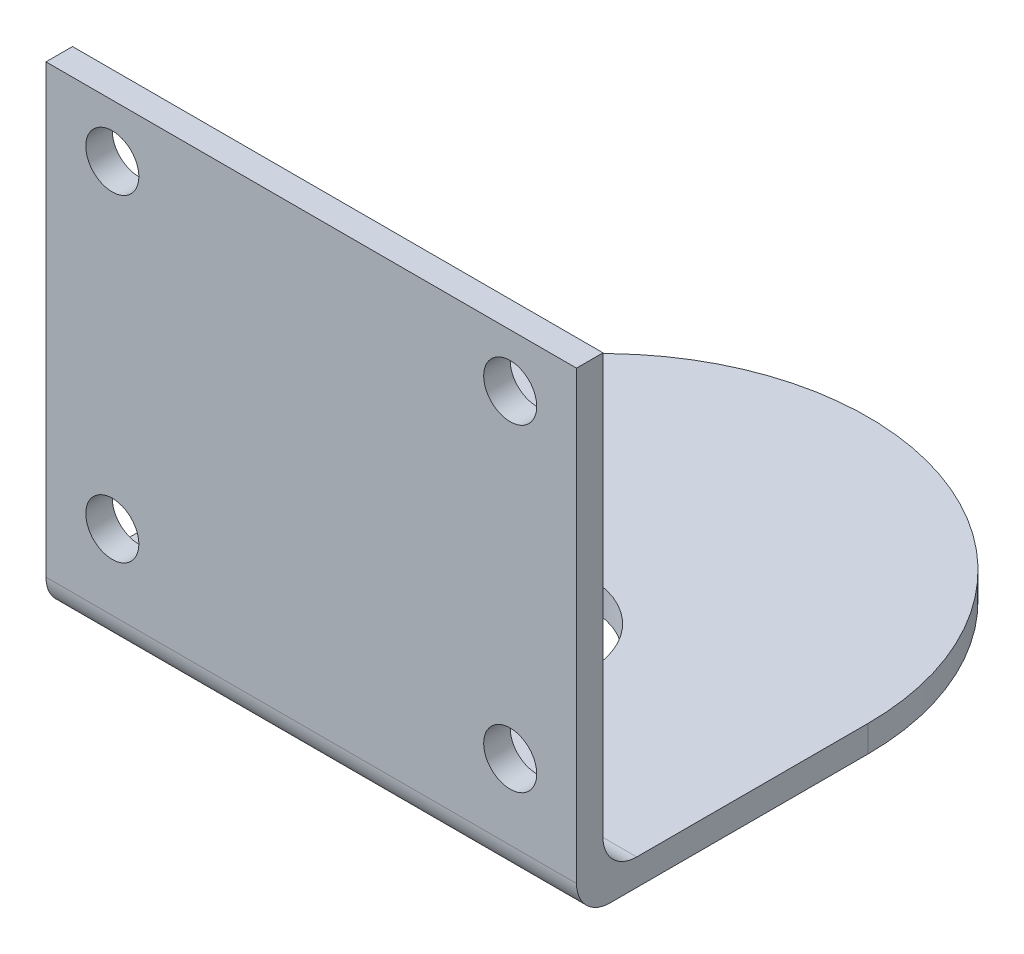
ISO-10303-21;
HEADER;
FILE_DESCRIPTION(('STEP AP214'),'2;1');
FILE_NAME('part.step','',(''),(''),'','','');
FILE_SCHEMA(('AUTOMOTIVE_DESIGN { 1 0 10303 214 1 1 1 1 }'));
ENDSEC;
DATA;
#1=APPLICATION_CONTEXT('core data for automotive mechanical design processes');
#2=APPLICATION_PROTOCOL_DEFINITION('international standard','automotive_design',2000,#1);
#3=PRODUCT_CONTEXT('',#1,'mechanical');
#4=PRODUCT('Part','Part','',(#3));
#5=PRODUCT_RELATED_PRODUCT_CATEGORY('part','',(#4));
#6=PRODUCT_DEFINITION_FORMATION('','',#4);
#7=PRODUCT_DEFINITION_CONTEXT('part definition',#1,'design');
#8=PRODUCT_DEFINITION('design','',#6,#7);
#9=PRODUCT_DEFINITION_SHAPE('','',#8);
#10=(LENGTH_UNIT() NAMED_UNIT(*) SI_UNIT(.MILLI.,.METRE.));
#11=(NAMED_UNIT(*) PLANE_ANGLE_UNIT() SI_UNIT($,.RADIAN.));
#12=(NAMED_UNIT(*) SI_UNIT($,.STERADIAN.) SOLID_ANGLE_UNIT());
#13=UNCERTAINTY_MEASURE_WITH_UNIT(LENGTH_MEASURE(1.E-05),#10,'distance_accuracy_value','');
#14=(GEOMETRIC_REPRESENTATION_CONTEXT(3) GLOBAL_UNCERTAINTY_ASSIGNED_CONTEXT((#13)) GLOBAL_UNIT_ASSIGNED_CONTEXT((#10,
#11,#12)) REPRESENTATION_CONTEXT('',''));
#15=CARTESIAN_POINT('',(0.,0.,0.));
#16=DIRECTION('',(0.,0.,1.));
#17=DIRECTION('',(1.,0.,0.));
#18=AXIS2_PLACEMENT_3D('',#15,#16,#17);
#19=CARTESIAN_POINT('',(-20.0025,-18.0975,2.));
#20=DIRECTION('',(0.,1.,0.));
#21=DIRECTION('',(0.,0.,1.));
#22=AXIS2_PLACEMENT_3D('',#19,#20,#21);
#23=PLANE('',#22);
#24=CARTESIAN_POINT('',(0.,-18.0975,-13.));
#25=DIRECTION('',(0.,1.,0.));
#26=DIRECTION('',(0.,0.,1.));
#27=AXIS2_PLACEMENT_3D('',#24,#25,#26);
#28=CIRCLE('',#27,6.);
#29=CARTESIAN_POINT('',(0.,-18.0975,-7.));
#30=VERTEX_POINT('',#29);
#31=EDGE_CURVE('E265',#30,#30,#28,.T.);
#32=ORIENTED_EDGE('',*,*,#31,.T.);
#33=EDGE_LOOP('',(#32));
#34=FACE_BOUND('',#33,.T.);
#35=DIRECTION('',(0.,0.,-1.));
#36=VECTOR('',#35,1.);
#37=CARTESIAN_POINT('',(20.0025,-18.0975,2.));
#38=LINE('',#37,#36);
#39=CARTESIAN_POINT('',(20.0025,-18.0975,-0.54));
#40=VERTEX_POINT('',#39);
#41=CARTESIAN_POINT('',(20.0025,-18.0975,-19.9975));
#42=VERTEX_POINT('',#41);
#43=EDGE_CURVE('E175',#40,#42,#38,.T.);
#44=ORIENTED_EDGE('',*,*,#43,.F.);
#45=DIRECTION('',(1.,0.,0.));
#46=VECTOR('',#45,1.);
#47=CARTESIAN_POINT('',(-20.0025,-18.0975,-0.54));
#48=LINE('',#47,#46);
#49=CARTESIAN_POINT('',(-20.0025,-18.0975,-0.54));
#50=VERTEX_POINT('',#49);
#51=EDGE_CURVE('E59',#40,#50,#48,.F.);
#52=ORIENTED_EDGE('',*,*,#51,.T.);
#53=DIRECTION('',(0.,0.,-1.));
#54=VECTOR('',#53,1.);
#55=CARTESIAN_POINT('',(-20.0025,-18.0975,2.));
#56=LINE('',#55,#54);
#57=CARTESIAN_POINT('',(-20.0025,-18.0975,-19.9975));
#58=VERTEX_POINT('',#57);
#59=EDGE_CURVE('E156',#50,#58,#56,.T.);
#60=ORIENTED_EDGE('',*,*,#59,.T.);
#61=CARTESIAN_POINT('',(0.,-18.0975,-19.9975));
#62=DIRECTION('',(0.,-1.,0.));
#63=DIRECTION('',(0.,0.,-1.));
#64=AXIS2_PLACEMENT_3D('',#61,#62,#63);
#65=CIRCLE('',#64,20.0025);
#66=EDGE_CURVE('E119',#58,#42,#65,.T.);
#67=ORIENTED_EDGE('',*,*,#66,.T.);
#68=EDGE_LOOP('',(#44,#52,#60,#67));
#69=FACE_BOUND('',#68,.T.);
#70=ADVANCED_FACE('F42',(#34,#69),#23,.F.);
#71=CARTESIAN_POINT('',(20.0025,-18.0975,2.));
#72=DIRECTION('',(-1.,0.,0.));
#73=DIRECTION('',(0.,0.,1.));
#74=AXIS2_PLACEMENT_3D('',#71,#72,#73);
#75=PLANE('',#74);
#76=DIRECTION('',(0.,1.,0.));
#77=VECTOR('',#76,1.);
#78=CARTESIAN_POINT('',(20.0025,-18.0975,2.));
#79=LINE('',#78,#77);
#80=CARTESIAN_POINT('',(20.0025,-15.5575,2.));
#81=VERTEX_POINT('',#80);
#82=CARTESIAN_POINT('',(20.0025,18.0975,2.));
#83=VERTEX_POINT('',#82);
#84=EDGE_CURVE('E145',#81,#83,#79,.T.);
#85=ORIENTED_EDGE('',*,*,#84,.F.);
#86=CARTESIAN_POINT('',(20.0025,-15.5575,-0.54));
#87=DIRECTION('',(-1.,0.,0.));
#88=DIRECTION('',(0.,0.,1.));
#89=AXIS2_PLACEMENT_3D('',#86,#87,#88);
#90=CIRCLE('',#89,2.54);
#91=EDGE_CURVE('E67',#81,#40,#90,.F.);
#92=ORIENTED_EDGE('',*,*,#91,.T.);
#93=ORIENTED_EDGE('',*,*,#43,.T.);
#94=DIRECTION('',(0.,-1.,0.));
#95=VECTOR('',#94,1.);
#96=CARTESIAN_POINT('',(20.0025,-16.0975,-19.9975));
#97=LINE('',#96,#95);
#98=CARTESIAN_POINT('',(20.0025,-16.0975,-19.9975));
#99=VERTEX_POINT('',#98);
#100=EDGE_CURVE('E127',#99,#42,#97,.T.);
#101=ORIENTED_EDGE('',*,*,#100,.F.);
#102=DIRECTION('',(0.,0.,-1.));
#103=VECTOR('',#102,1.);
#104=CARTESIAN_POINT('',(20.0025,-16.0975,0.));
#105=LINE('',#104,#103);
#106=CARTESIAN_POINT('',(20.0025,-16.0975,-2.54));
#107=VERTEX_POINT('',#106);
#108=EDGE_CURVE('E128',#107,#99,#105,.T.);
#109=ORIENTED_EDGE('',*,*,#108,.F.);
#110=CARTESIAN_POINT('',(20.0025,-13.5575,-2.54));
#111=DIRECTION('',(-1.,0.,0.));
#112=DIRECTION('',(0.,0.,1.));
#113=AXIS2_PLACEMENT_3D('',#110,#111,#112);
#114=CIRCLE('',#113,2.54);
#115=CARTESIAN_POINT('',(20.0025,-13.5575,0.));
#116=VERTEX_POINT('',#115);
#117=EDGE_CURVE('E11',#107,#116,#114,.T.);
#118=ORIENTED_EDGE('',*,*,#117,.T.);
#119=DIRECTION('',(0.,1.,0.));
#120=VECTOR('',#119,1.);
#121=CARTESIAN_POINT('',(20.0025,-18.0975,0.));
#122=LINE('',#121,#120);
#123=CARTESIAN_POINT('',(20.0025,18.0975,0.));
#124=VERTEX_POINT('',#123);
#125=EDGE_CURVE('E143',#116,#124,#122,.T.);
#126=ORIENTED_EDGE('',*,*,#125,.T.);
#127=DIRECTION('',(0.,0.,-1.));
#128=VECTOR('',#127,1.);
#129=CARTESIAN_POINT('',(20.0025,18.0975,2.));
#130=LINE('',#129,#128);
#131=EDGE_CURVE('E171',#83,#124,#130,.T.);
#132=ORIENTED_EDGE('',*,*,#131,.F.);
#133=EDGE_LOOP('',(#85,#92,#93,#101,#109,#118,#126,#132));
#134=FACE_BOUND('',#133,.T.);
#135=ADVANCED_FACE('F217',(#134),#75,.F.);
#136=CARTESIAN_POINT('',(-20.0025,18.0975,2.));
#137=DIRECTION('',(0.,1.,0.));
#138=DIRECTION('',(0.,0.,1.));
#139=AXIS2_PLACEMENT_3D('',#136,#137,#138);
#140=PLANE('',#139);
#141=DIRECTION('',(1.,0.,0.));
#142=VECTOR('',#141,1.);
#143=CARTESIAN_POINT('',(-20.0025,18.0975,0.));
#144=LINE('',#143,#142);
#145=CARTESIAN_POINT('',(-20.0025,18.0975,0.));
#146=VERTEX_POINT('',#145);
#147=EDGE_CURVE('E159',#146,#124,#144,.T.);
#148=ORIENTED_EDGE('',*,*,#147,.F.);
#149=DIRECTION('',(0.,0.,-1.));
#150=VECTOR('',#149,1.);
#151=CARTESIAN_POINT('',(-20.0025,18.0975,2.));
#152=LINE('',#151,#150);
#153=CARTESIAN_POINT('',(-20.0025,18.0975,2.));
#154=VERTEX_POINT('',#153);
#155=EDGE_CURVE('E167',#154,#146,#152,.T.);
#156=ORIENTED_EDGE('',*,*,#155,.F.);
#157=DIRECTION('',(1.,0.,0.));
#158=VECTOR('',#157,1.);
#159=CARTESIAN_POINT('',(-20.0025,18.0975,2.));
#160=LINE('',#159,#158);
#161=EDGE_CURVE('E148',#154,#83,#160,.T.);
#162=ORIENTED_EDGE('',*,*,#161,.T.);
#163=ORIENTED_EDGE('',*,*,#131,.T.);
#164=EDGE_LOOP('',(#148,#156,#162,#163));
#165=FACE_BOUND('',#164,.T.);
#166=ADVANCED_FACE('F225',(#165),#140,.T.);
#167=CARTESIAN_POINT('',(-20.0025,-18.0975,2.));
#168=DIRECTION('',(-1.,0.,0.));
#169=DIRECTION('',(0.,0.,1.));
#170=AXIS2_PLACEMENT_3D('',#167,#168,#169);
#171=PLANE('',#170);
#172=ORIENTED_EDGE('',*,*,#59,.F.);
#173=CARTESIAN_POINT('',(-20.0025,-15.5575,-0.54));
#174=DIRECTION('',(-1.,0.,0.));
#175=DIRECTION('',(0.,0.,1.));
#176=AXIS2_PLACEMENT_3D('',#173,#174,#175);
#177=CIRCLE('',#176,2.54);
#178=CARTESIAN_POINT('',(-20.0025,-15.5575,2.));
#179=VERTEX_POINT('',#178);
#180=EDGE_CURVE('E193',#50,#179,#177,.T.);
#181=ORIENTED_EDGE('',*,*,#180,.T.);
#182=DIRECTION('',(0.,1.,0.));
#183=VECTOR('',#182,1.);
#184=CARTESIAN_POINT('',(-20.0025,-18.0975,2.));
#185=LINE('',#184,#183);
#186=EDGE_CURVE('E153',#179,#154,#185,.T.);
#187=ORIENTED_EDGE('',*,*,#186,.T.);
#188=ORIENTED_EDGE('',*,*,#155,.T.);
#189=DIRECTION('',(0.,1.,0.));
#190=VECTOR('',#189,1.);
#191=CARTESIAN_POINT('',(-20.0025,-18.0975,0.));
#192=LINE('',#191,#190);
#193=CARTESIAN_POINT('',(-20.0025,-13.5575,0.));
#194=VERTEX_POINT('',#193);
#195=EDGE_CURVE('E149',#194,#146,#192,.T.);
#196=ORIENTED_EDGE('',*,*,#195,.F.);
#197=CARTESIAN_POINT('',(-20.0025,-13.5575,-2.54));
#198=DIRECTION('',(-1.,0.,0.));
#199=DIRECTION('',(0.,0.,1.));
#200=AXIS2_PLACEMENT_3D('',#197,#198,#199);
#201=CIRCLE('',#200,2.54);
#202=CARTESIAN_POINT('',(-20.0025,-16.0975,-2.54));
#203=VERTEX_POINT('',#202);
#204=EDGE_CURVE('E52',#194,#203,#201,.F.);
#205=ORIENTED_EDGE('',*,*,#204,.T.);
#206=DIRECTION('',(0.,0.,-1.));
#207=VECTOR('',#206,1.);
#208=CARTESIAN_POINT('',(-20.0025,-16.0975,0.));
#209=LINE('',#208,#207);
#210=CARTESIAN_POINT('',(-20.0025,-16.0975,-19.9975));
#211=VERTEX_POINT('',#210);
#212=EDGE_CURVE('E108',#203,#211,#209,.T.);
#213=ORIENTED_EDGE('',*,*,#212,.T.);
#214=DIRECTION('',(0.,-1.,0.));
#215=VECTOR('',#214,1.);
#216=CARTESIAN_POINT('',(-20.0025,-16.0975,-19.9975));
#217=LINE('',#216,#215);
#218=EDGE_CURVE('E111',#211,#58,#217,.T.);
#219=ORIENTED_EDGE('',*,*,#218,.T.);
#220=EDGE_LOOP('',(#172,#181,#187,#188,#196,#205,#213,#219));
#221=FACE_BOUND('',#220,.T.);
#222=ADVANCED_FACE('F110',(#221),#171,.T.);
#223=CARTESIAN_POINT('',(0.,0.,2.));
#224=DIRECTION('',(0.,0.,1.));
#225=DIRECTION('',(1.,0.,0.));
#226=AXIS2_PLACEMENT_3D('',#223,#224,#225);
#227=PLANE('',#226);
#228=CARTESIAN_POINT('',(15.0025,-9.9025,2.));
#229=DIRECTION('',(0.,0.,-1.));
#230=DIRECTION('',(-1.,0.,0.));
#231=AXIS2_PLACEMENT_3D('',#228,#229,#230);
#232=CIRCLE('',#231,2.);
#233=CARTESIAN_POINT('',(13.0025,-9.9025,2.));
#234=VERTEX_POINT('',#233);
#235=EDGE_CURVE('E267',#234,#234,#232,.T.);
#236=ORIENTED_EDGE('',*,*,#235,.T.);
#237=EDGE_LOOP('',(#236));
#238=FACE_BOUND('',#237,.T.);
#239=CARTESIAN_POINT('',(-15.0025,-9.9025,2.));
#240=DIRECTION('',(0.,0.,-1.));
#241=DIRECTION('',(-1.,0.,0.));
#242=AXIS2_PLACEMENT_3D('',#239,#240,#241);
#243=CIRCLE('',#242,2.00000000000001);
#244=CARTESIAN_POINT('',(-17.0025,-9.9025,2.));
#245=VERTEX_POINT('',#244);
#246=EDGE_CURVE('E288',#245,#245,#243,.T.);
#247=ORIENTED_EDGE('',*,*,#246,.T.);
#248=EDGE_LOOP('',(#247));
#249=FACE_BOUND('',#248,.T.);
#250=CARTESIAN_POINT('',(-15.0025,14.0975,2.));
#251=DIRECTION('',(0.,0.,-1.));
#252=DIRECTION('',(-1.,0.,0.));
#253=AXIS2_PLACEMENT_3D('',#250,#251,#252);
#254=CIRCLE('',#253,2.);
#255=CARTESIAN_POINT('',(-17.0025,14.0975,2.));
#256=VERTEX_POINT('',#255);
#257=EDGE_CURVE('E280',#256,#256,#254,.T.);
#258=ORIENTED_EDGE('',*,*,#257,.T.);
#259=EDGE_LOOP('',(#258));
#260=FACE_BOUND('',#259,.T.);
#261=CARTESIAN_POINT('',(15.0025,14.0975,2.));
#262=DIRECTION('',(0.,0.,-1.));
#263=DIRECTION('',(-1.,0.,0.));
#264=AXIS2_PLACEMENT_3D('',#261,#262,#263);
#265=CIRCLE('',#264,2.);
#266=CARTESIAN_POINT('',(13.0025,14.0975,2.));
#267=VERTEX_POINT('',#266);
#268=EDGE_CURVE('E141',#267,#267,#265,.T.);
#269=ORIENTED_EDGE('',*,*,#268,.T.);
#270=EDGE_LOOP('',(#269));
#271=FACE_BOUND('',#270,.T.);
#272=ORIENTED_EDGE('',*,*,#186,.F.);
#273=DIRECTION('',(1.,0.,0.));
#274=VECTOR('',#273,1.);
#275=CARTESIAN_POINT('',(20.0025,-15.5575,2.));
#276=LINE('',#275,#274);
#277=EDGE_CURVE('E185',#179,#81,#276,.T.);
#278=ORIENTED_EDGE('',*,*,#277,.T.);
#279=ORIENTED_EDGE('',*,*,#84,.T.);
#280=ORIENTED_EDGE('',*,*,#161,.F.);
#281=EDGE_LOOP('',(#272,#278,#279,#280));
#282=FACE_BOUND('',#281,.T.);
#283=ADVANCED_FACE('F204',(#238,#249,#260,#271,#282),#227,.T.);
#284=CARTESIAN_POINT('',(0.,0.,0.));
#285=DIRECTION('',(0.,0.,1.));
#286=DIRECTION('',(1.,0.,0.));
#287=AXIS2_PLACEMENT_3D('',#284,#285,#286);
#288=PLANE('',#287);
#289=CARTESIAN_POINT('',(15.0025,-9.9025,0.));
#290=DIRECTION('',(0.,0.,-1.));
#291=DIRECTION('',(-1.,0.,0.));
#292=AXIS2_PLACEMENT_3D('',#289,#290,#291);
#293=CIRCLE('',#292,2.);
#294=CARTESIAN_POINT('',(13.0025,-9.9025,0.));
#295=VERTEX_POINT('',#294);
#296=EDGE_CURVE('E272',#295,#295,#293,.T.);
#297=ORIENTED_EDGE('',*,*,#296,.F.);
#298=EDGE_LOOP('',(#297));
#299=FACE_BOUND('',#298,.T.);
#300=CARTESIAN_POINT('',(-15.0025,-9.9025,0.));
#301=DIRECTION('',(0.,0.,-1.));
#302=DIRECTION('',(-1.,0.,0.));
#303=AXIS2_PLACEMENT_3D('',#300,#301,#302);
#304=CIRCLE('',#303,2.00000000000001);
#305=CARTESIAN_POINT('',(-17.0025,-9.9025,0.));
#306=VERTEX_POINT('',#305);
#307=EDGE_CURVE('E284',#306,#306,#304,.T.);
#308=ORIENTED_EDGE('',*,*,#307,.F.);
#309=EDGE_LOOP('',(#308));
#310=FACE_BOUND('',#309,.T.);
#311=CARTESIAN_POINT('',(-15.0025,14.0975,0.));
#312=DIRECTION('',(0.,0.,-1.));
#313=DIRECTION('',(-1.,0.,0.));
#314=AXIS2_PLACEMENT_3D('',#311,#312,#313);
#315=CIRCLE('',#314,2.);
#316=CARTESIAN_POINT('',(-17.0025,14.0975,0.));
#317=VERTEX_POINT('',#316);
#318=EDGE_CURVE('E275',#317,#317,#315,.T.);
#319=ORIENTED_EDGE('',*,*,#318,.F.);
#320=EDGE_LOOP('',(#319));
#321=FACE_BOUND('',#320,.T.);
#322=CARTESIAN_POINT('',(15.0025,14.0975,0.));
#323=DIRECTION('',(0.,0.,-1.));
#324=DIRECTION('',(-1.,0.,0.));
#325=AXIS2_PLACEMENT_3D('',#322,#323,#324);
#326=CIRCLE('',#325,2.);
#327=CARTESIAN_POINT('',(13.0025,14.0975,0.));
#328=VERTEX_POINT('',#327);
#329=EDGE_CURVE('E279',#328,#328,#326,.T.);
#330=ORIENTED_EDGE('',*,*,#329,.F.);
#331=EDGE_LOOP('',(#330));
#332=FACE_BOUND('',#331,.T.);
#333=ORIENTED_EDGE('',*,*,#125,.F.);
#334=DIRECTION('',(-1.,0.,0.));
#335=VECTOR('',#334,1.);
#336=CARTESIAN_POINT('',(-20.0025,-13.5575,0.));
#337=LINE('',#336,#335);
#338=EDGE_CURVE('E178',#116,#194,#337,.T.);
#339=ORIENTED_EDGE('',*,*,#338,.T.);
#340=ORIENTED_EDGE('',*,*,#195,.T.);
#341=ORIENTED_EDGE('',*,*,#147,.T.);
#342=EDGE_LOOP('',(#333,#339,#340,#341));
#343=FACE_BOUND('',#342,.T.);
#344=ADVANCED_FACE('F234',(#299,#310,#321,#332,#343),#288,.F.);
#345=CARTESIAN_POINT('',(0.,-16.0975,-19.9975));
#346=DIRECTION('',(0.,-1.,0.));
#347=DIRECTION('',(0.,0.,-1.));
#348=AXIS2_PLACEMENT_3D('',#345,#346,#347);
#349=CYLINDRICAL_SURFACE('',#348,20.0025);
#350=ORIENTED_EDGE('',*,*,#66,.F.);
#351=ORIENTED_EDGE('',*,*,#218,.F.);
#352=CARTESIAN_POINT('',(0.,-16.0975,-19.9975));
#353=DIRECTION('',(0.,-1.,0.));
#354=DIRECTION('',(0.,0.,-1.));
#355=AXIS2_PLACEMENT_3D('',#352,#353,#354);
#356=CIRCLE('',#355,20.0025);
#357=EDGE_CURVE('E118',#211,#99,#356,.T.);
#358=ORIENTED_EDGE('',*,*,#357,.T.);
#359=ORIENTED_EDGE('',*,*,#100,.T.);
#360=EDGE_LOOP('',(#350,#351,#358,#359));
#361=FACE_BOUND('',#360,.T.);
#362=ADVANCED_FACE('F123',(#361),#349,.T.);
#363=CARTESIAN_POINT('',(0.,-16.0975,-19.9975));
#364=DIRECTION('',(0.,-1.,0.));
#365=DIRECTION('',(0.,0.,-1.));
#366=AXIS2_PLACEMENT_3D('',#363,#364,#365);
#367=PLANE('',#366);
#368=CARTESIAN_POINT('',(0.,-16.0975,-13.));
#369=DIRECTION('',(0.,-1.,0.));
#370=DIRECTION('',(0.,0.,-1.));
#371=AXIS2_PLACEMENT_3D('',#368,#369,#370);
#372=CIRCLE('',#371,6.);
#373=CARTESIAN_POINT('',(0.,-16.0975,-19.));
#374=VERTEX_POINT('',#373);
#375=EDGE_CURVE('E46',#374,#374,#372,.T.);
#376=ORIENTED_EDGE('',*,*,#375,.T.);
#377=EDGE_LOOP('',(#376));
#378=FACE_BOUND('',#377,.T.);
#379=ORIENTED_EDGE('',*,*,#212,.F.);
#380=DIRECTION('',(-1.,0.,0.));
#381=VECTOR('',#380,1.);
#382=CARTESIAN_POINT('',(20.0025,-16.0975,-2.54));
#383=LINE('',#382,#381);
#384=EDGE_CURVE('E182',#203,#107,#383,.F.);
#385=ORIENTED_EDGE('',*,*,#384,.T.);
#386=ORIENTED_EDGE('',*,*,#108,.T.);
#387=ORIENTED_EDGE('',*,*,#357,.F.);
#388=EDGE_LOOP('',(#379,#385,#386,#387));
#389=FACE_BOUND('',#388,.T.);
#390=ADVANCED_FACE('F130',(#378,#389),#367,.F.);
#391=CARTESIAN_POINT('',(0.,-13.5575,-2.54));
#392=DIRECTION('',(1.,0.,0.));
#393=DIRECTION('',(0.,0.,-1.));
#394=AXIS2_PLACEMENT_3D('',#391,#392,#393);
#395=CYLINDRICAL_SURFACE('',#394,2.54);
#396=ORIENTED_EDGE('',*,*,#117,.F.);
#397=ORIENTED_EDGE('',*,*,#384,.F.);
#398=ORIENTED_EDGE('',*,*,#204,.F.);
#399=ORIENTED_EDGE('',*,*,#338,.F.);
#400=EDGE_LOOP('',(#396,#397,#398,#399));
#401=FACE_BOUND('',#400,.T.);
#402=ADVANCED_FACE('F207',(#401),#395,.F.);
#403=CARTESIAN_POINT('',(0.,-15.5575,-0.54));
#404=DIRECTION('',(-1.,0.,0.));
#405=DIRECTION('',(0.,0.,1.));
#406=AXIS2_PLACEMENT_3D('',#403,#404,#405);
#407=CYLINDRICAL_SURFACE('',#406,2.54);
#408=ORIENTED_EDGE('',*,*,#180,.F.);
#409=ORIENTED_EDGE('',*,*,#51,.F.);
#410=ORIENTED_EDGE('',*,*,#91,.F.);
#411=ORIENTED_EDGE('',*,*,#277,.F.);
#412=EDGE_LOOP('',(#408,#409,#410,#411));
#413=FACE_BOUND('',#412,.T.);
#414=ADVANCED_FACE('F44',(#413),#407,.T.);
#415=CARTESIAN_POINT('',(15.0025,14.0975,2.));
#416=DIRECTION('',(0.,0.,-1.));
#417=DIRECTION('',(-1.,0.,0.));
#418=AXIS2_PLACEMENT_3D('',#415,#416,#417);
#419=CYLINDRICAL_SURFACE('',#418,2.);
#420=ORIENTED_EDGE('',*,*,#268,.F.);
#421=EDGE_LOOP('',(#420));
#422=FACE_BOUND('',#421,.T.);
#423=ORIENTED_EDGE('',*,*,#329,.T.);
#424=EDGE_LOOP('',(#423));
#425=FACE_BOUND('',#424,.T.);
#426=ADVANCED_FACE('F206',(#422,#425),#419,.F.);
#427=CARTESIAN_POINT('',(-15.0025,14.0975,2.));
#428=DIRECTION('',(0.,0.,-1.));
#429=DIRECTION('',(-1.,0.,0.));
#430=AXIS2_PLACEMENT_3D('',#427,#428,#429);
#431=CYLINDRICAL_SURFACE('',#430,2.);
#432=ORIENTED_EDGE('',*,*,#257,.F.);
#433=EDGE_LOOP('',(#432));
#434=FACE_BOUND('',#433,.T.);
#435=ORIENTED_EDGE('',*,*,#318,.T.);
#436=EDGE_LOOP('',(#435));
#437=FACE_BOUND('',#436,.T.);
#438=ADVANCED_FACE('F212',(#434,#437),#431,.F.);
#439=CARTESIAN_POINT('',(-15.0025,-9.9025,2.));
#440=DIRECTION('',(0.,0.,-1.));
#441=DIRECTION('',(-1.,0.,0.));
#442=AXIS2_PLACEMENT_3D('',#439,#440,#441);
#443=CYLINDRICAL_SURFACE('',#442,2.00000000000001);
#444=ORIENTED_EDGE('',*,*,#246,.F.);
#445=EDGE_LOOP('',(#444));
#446=FACE_BOUND('',#445,.T.);
#447=ORIENTED_EDGE('',*,*,#307,.T.);
#448=EDGE_LOOP('',(#447));
#449=FACE_BOUND('',#448,.T.);
#450=ADVANCED_FACE('F249',(#446,#449),#443,.F.);
#451=CARTESIAN_POINT('',(15.0025,-9.9025,2.));
#452=DIRECTION('',(0.,0.,-1.));
#453=DIRECTION('',(-1.,0.,0.));
#454=AXIS2_PLACEMENT_3D('',#451,#452,#453);
#455=CYLINDRICAL_SURFACE('',#454,2.);
#456=ORIENTED_EDGE('',*,*,#235,.F.);
#457=EDGE_LOOP('',(#456));
#458=FACE_BOUND('',#457,.T.);
#459=ORIENTED_EDGE('',*,*,#296,.T.);
#460=EDGE_LOOP('',(#459));
#461=FACE_BOUND('',#460,.T.);
#462=ADVANCED_FACE('F245',(#458,#461),#455,.F.);
#463=CARTESIAN_POINT('',(0.,18.0975,-13.));
#464=DIRECTION('',(0.,-1.,0.));
#465=DIRECTION('',(0.,0.,-1.));
#466=AXIS2_PLACEMENT_3D('',#463,#464,#465);
#467=CYLINDRICAL_SURFACE('',#466,6.);
#468=ORIENTED_EDGE('',*,*,#375,.F.);
#469=EDGE_LOOP('',(#468));
#470=FACE_BOUND('',#469,.T.);
#471=ORIENTED_EDGE('',*,*,#31,.F.);
#472=EDGE_LOOP('',(#471));
#473=FACE_BOUND('',#472,.T.);
#474=ADVANCED_FACE('F248',(#470,#473),#467,.F.);
#475=CLOSED_SHELL('',(#70,#135,#166,#222,#283,#344,#362,#390,#402,#414,#426,#438,#450,#462,#474));
#476=MANIFOLD_SOLID_BREP('B2',#475);
#477=ADVANCED_BREP_SHAPE_REPRESENTATION('',(#18,#476),#14);
#478=SHAPE_DEFINITION_REPRESENTATION(#9,#477);
ENDSEC;
END-ISO-10303-21;
